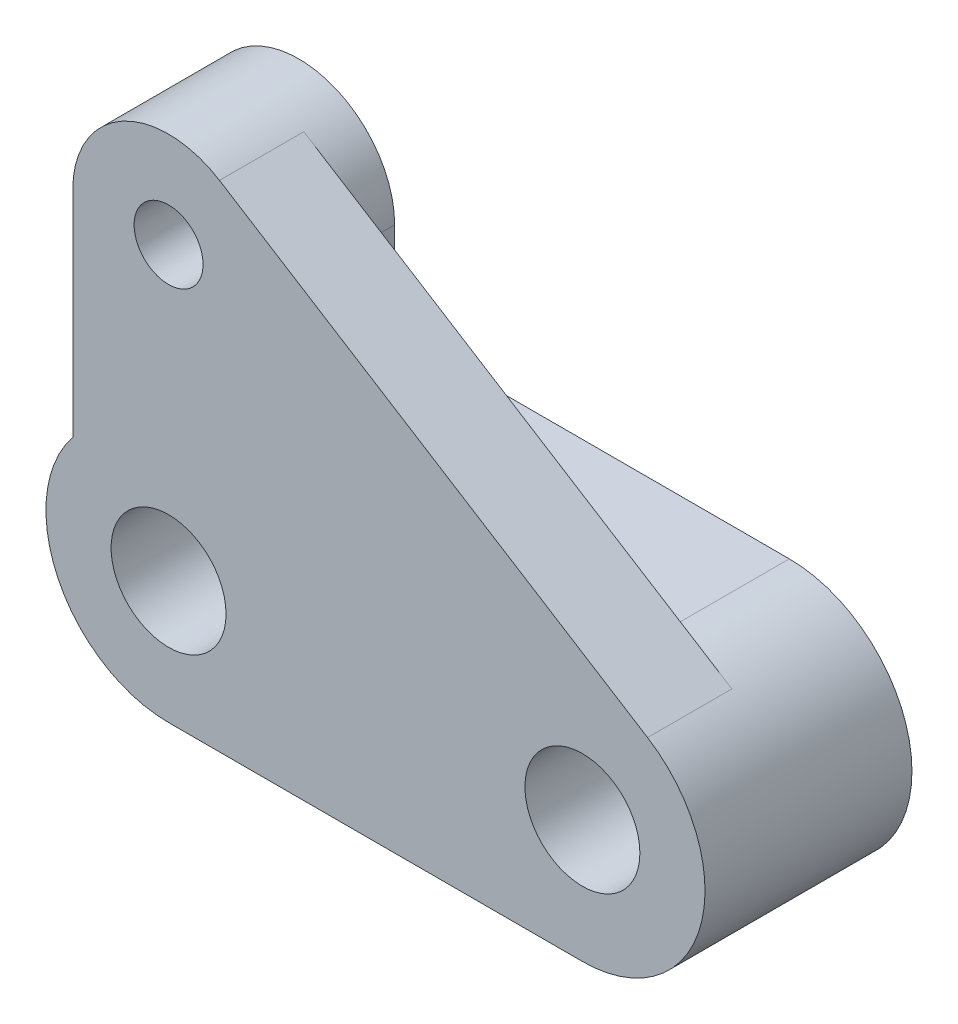
ISO-10303-21;
HEADER;
FILE_DESCRIPTION(('STEP AP214'),'2;1');
FILE_NAME('part.step','',(''),(''),'','','');
FILE_SCHEMA(('AUTOMOTIVE_DESIGN { 1 0 10303 214 1 1 1 1 }'));
ENDSEC;
DATA;
#1=APPLICATION_CONTEXT('core data for automotive mechanical design processes');
#2=APPLICATION_PROTOCOL_DEFINITION('international standard','automotive_design',2000,#1);
#3=PRODUCT_CONTEXT('',#1,'mechanical');
#4=PRODUCT('Part','Part','',(#3));
#5=PRODUCT_RELATED_PRODUCT_CATEGORY('part','',(#4));
#6=PRODUCT_DEFINITION_FORMATION('','',#4);
#7=PRODUCT_DEFINITION_CONTEXT('part definition',#1,'design');
#8=PRODUCT_DEFINITION('design','',#6,#7);
#9=PRODUCT_DEFINITION_SHAPE('','',#8);
#10=(LENGTH_UNIT() NAMED_UNIT(*) SI_UNIT(.MILLI.,.METRE.));
#11=(NAMED_UNIT(*) PLANE_ANGLE_UNIT() SI_UNIT($,.RADIAN.));
#12=(NAMED_UNIT(*) SI_UNIT($,.STERADIAN.) SOLID_ANGLE_UNIT());
#13=UNCERTAINTY_MEASURE_WITH_UNIT(LENGTH_MEASURE(1.E-05),#10,'distance_accuracy_value','');
#14=(GEOMETRIC_REPRESENTATION_CONTEXT(3) GLOBAL_UNCERTAINTY_ASSIGNED_CONTEXT((#13)) GLOBAL_UNIT_ASSIGNED_CONTEXT((#10,
#11,#12)) REPRESENTATION_CONTEXT('',''));
#15=CARTESIAN_POINT('',(0.,0.,0.));
#16=DIRECTION('',(0.,0.,1.));
#17=DIRECTION('',(1.,0.,0.));
#18=AXIS2_PLACEMENT_3D('',#15,#16,#17);
#19=CARTESIAN_POINT('',(-108.,32.,27.));
#20=DIRECTION('',(0.,-1.,0.));
#21=DIRECTION('',(1.,0.,0.));
#22=AXIS2_PLACEMENT_3D('',#19,#20,#21);
#23=PLANE('',#22);
#24=DIRECTION('',(1.,0.,0.));
#25=VECTOR('',#24,1.);
#26=CARTESIAN_POINT('',(0.,32.,5.));
#27=LINE('',#26,#25);
#28=CARTESIAN_POINT('',(-68.,32.,5.));
#29=VERTEX_POINT('',#28);
#30=CARTESIAN_POINT('',(0.,32.,5.));
#31=VERTEX_POINT('',#30);
#32=EDGE_CURVE('E136',#29,#31,#27,.T.);
#33=ORIENTED_EDGE('',*,*,#32,.T.);
#34=DIRECTION('',(0.,0.,-1.));
#35=VECTOR('',#34,1.);
#36=CARTESIAN_POINT('',(0.,32.,27.));
#37=LINE('',#36,#35);
#38=CARTESIAN_POINT('',(0.,32.,-27.));
#39=VERTEX_POINT('',#38);
#40=EDGE_CURVE('E149',#31,#39,#37,.T.);
#41=ORIENTED_EDGE('',*,*,#40,.T.);
#42=DIRECTION('',(-1.,0.,0.));
#43=VECTOR('',#42,1.);
#44=CARTESIAN_POINT('',(-108.,32.,-27.));
#45=LINE('',#44,#43);
#46=CARTESIAN_POINT('',(-108.,32.,-27.));
#47=VERTEX_POINT('',#46);
#48=EDGE_CURVE('E241',#39,#47,#45,.T.);
#49=ORIENTED_EDGE('',*,*,#48,.T.);
#50=DIRECTION('',(0.,0.,-1.));
#51=VECTOR('',#50,1.);
#52=CARTESIAN_POINT('',(-108.,32.,27.));
#53=LINE('',#52,#51);
#54=CARTESIAN_POINT('',(-108.,32.,-7.));
#55=VERTEX_POINT('',#54);
#56=EDGE_CURVE('E257',#55,#47,#53,.T.);
#57=ORIENTED_EDGE('',*,*,#56,.F.);
#58=DIRECTION('',(1.,0.,0.));
#59=VECTOR('',#58,1.);
#60=CARTESIAN_POINT('',(-108.,32.,-7.));
#61=LINE('',#60,#59);
#62=CARTESIAN_POINT('',(-68.,32.,-7.));
#63=VERTEX_POINT('',#62);
#64=EDGE_CURVE('E62',#55,#63,#61,.T.);
#65=ORIENTED_EDGE('',*,*,#64,.T.);
#66=DIRECTION('',(0.,0.,1.));
#67=VECTOR('',#66,1.);
#68=CARTESIAN_POINT('',(-68.,32.,27.));
#69=LINE('',#68,#67);
#70=EDGE_CURVE('E262',#63,#29,#69,.T.);
#71=ORIENTED_EDGE('',*,*,#70,.T.);
#72=EDGE_LOOP('',(#33,#41,#49,#57,#65,#71));
#73=FACE_BOUND('',#72,.T.);
#74=ADVANCED_FACE('F39',(#73),#23,.F.);
#75=CARTESIAN_POINT('',(0.,0.,27.));
#76=DIRECTION('',(0.,0.,-1.));
#77=DIRECTION('',(-1.,0.,0.));
#78=AXIS2_PLACEMENT_3D('',#75,#76,#77);
#79=CYLINDRICAL_SURFACE('',#78,32.);
#80=DIRECTION('',(0.,0.,1.));
#81=VECTOR('',#80,1.);
#82=CARTESIAN_POINT('',(17.0027440323474,27.1091625722831,5.));
#83=LINE('',#82,#81);
#84=CARTESIAN_POINT('',(17.0027440323474,27.1091625722831,5.));
#85=VERTEX_POINT('',#84);
#86=CARTESIAN_POINT('',(17.0027440323474,27.1091625722831,27.));
#87=VERTEX_POINT('',#86);
#88=EDGE_CURVE('E123',#85,#87,#83,.T.);
#89=ORIENTED_EDGE('',*,*,#88,.T.);
#90=CARTESIAN_POINT('',(0.,0.,27.));
#91=DIRECTION('',(0.,0.,1.));
#92=DIRECTION('',(1.,0.,0.));
#93=AXIS2_PLACEMENT_3D('',#90,#91,#92);
#94=CIRCLE('',#93,32.);
#95=CARTESIAN_POINT('',(0.,-32.,27.));
#96=VERTEX_POINT('',#95);
#97=EDGE_CURVE('E228',#96,#87,#94,.T.);
#98=ORIENTED_EDGE('',*,*,#97,.F.);
#99=DIRECTION('',(0.,0.,-1.));
#100=VECTOR('',#99,1.);
#101=CARTESIAN_POINT('',(0.,-32.,27.));
#102=LINE('',#101,#100);
#103=CARTESIAN_POINT('',(0.,-32.,-27.));
#104=VERTEX_POINT('',#103);
#105=EDGE_CURVE('E238',#96,#104,#102,.T.);
#106=ORIENTED_EDGE('',*,*,#105,.T.);
#107=CARTESIAN_POINT('',(0.,0.,-27.));
#108=DIRECTION('',(0.,0.,1.));
#109=DIRECTION('',(1.,0.,0.));
#110=AXIS2_PLACEMENT_3D('',#107,#108,#109);
#111=CIRCLE('',#110,32.);
#112=EDGE_CURVE('E224',#104,#39,#111,.T.);
#113=ORIENTED_EDGE('',*,*,#112,.T.);
#114=ORIENTED_EDGE('',*,*,#40,.F.);
#115=CARTESIAN_POINT('',(0.,0.,5.));
#116=DIRECTION('',(0.,0.,-1.));
#117=DIRECTION('',(1.,0.,0.));
#118=AXIS2_PLACEMENT_3D('',#115,#116,#117);
#119=CIRCLE('',#118,32.);
#120=EDGE_CURVE('E140',#31,#85,#119,.T.);
#121=ORIENTED_EDGE('',*,*,#120,.T.);
#122=EDGE_LOOP('',(#89,#98,#106,#113,#114,#121));
#123=FACE_BOUND('',#122,.T.);
#124=ADVANCED_FACE('F147',(#123),#79,.T.);
#125=CARTESIAN_POINT('',(-108.,76.,-7.));
#126=DIRECTION('',(0.,0.,1.));
#127=DIRECTION('',(1.,0.,0.));
#128=AXIS2_PLACEMENT_3D('',#125,#126,#127);
#129=CYLINDRICAL_SURFACE('',#128,25.);
#130=DIRECTION('',(0.,0.,1.));
#131=VECTOR('',#130,1.);
#132=CARTESIAN_POINT('',(-94.7166062247286,97.1790332595962,5.));
#133=LINE('',#132,#131);
#134=CARTESIAN_POINT('',(-94.7166062247286,97.1790332595962,5.));
#135=VERTEX_POINT('',#134);
#136=CARTESIAN_POINT('',(-94.7166062247286,97.1790332595962,27.));
#137=VERTEX_POINT('',#136);
#138=EDGE_CURVE('E135',#135,#137,#133,.T.);
#139=ORIENTED_EDGE('',*,*,#138,.F.);
#140=CARTESIAN_POINT('',(-108.,76.,5.));
#141=DIRECTION('',(0.,0.,-1.));
#142=DIRECTION('',(1.,0.,0.));
#143=AXIS2_PLACEMENT_3D('',#140,#141,#142);
#144=CIRCLE('',#143,25.);
#145=CARTESIAN_POINT('',(-83.,76.,5.));
#146=VERTEX_POINT('',#145);
#147=EDGE_CURVE('E143',#135,#146,#144,.T.);
#148=ORIENTED_EDGE('',*,*,#147,.T.);
#149=DIRECTION('',(0.,0.,1.));
#150=VECTOR('',#149,1.);
#151=CARTESIAN_POINT('',(-83.,76.,-7.));
#152=LINE('',#151,#150);
#153=CARTESIAN_POINT('',(-83.,76.,-7.));
#154=VERTEX_POINT('',#153);
#155=EDGE_CURVE('E207',#154,#146,#152,.T.);
#156=ORIENTED_EDGE('',*,*,#155,.F.);
#157=CARTESIAN_POINT('',(-108.,76.,-7.));
#158=DIRECTION('',(0.,0.,-1.));
#159=DIRECTION('',(-1.,0.,0.));
#160=AXIS2_PLACEMENT_3D('',#157,#158,#159);
#161=CIRCLE('',#160,25.);
#162=CARTESIAN_POINT('',(-133.,76.,-7.));
#163=VERTEX_POINT('',#162);
#164=EDGE_CURVE('E177',#163,#154,#161,.T.);
#165=ORIENTED_EDGE('',*,*,#164,.F.);
#166=DIRECTION('',(0.,0.,1.));
#167=VECTOR('',#166,1.);
#168=CARTESIAN_POINT('',(-133.,76.,-7.));
#169=LINE('',#168,#167);
#170=CARTESIAN_POINT('',(-133.,76.,27.));
#171=VERTEX_POINT('',#170);
#172=EDGE_CURVE('E195',#163,#171,#169,.T.);
#173=ORIENTED_EDGE('',*,*,#172,.T.);
#174=CARTESIAN_POINT('',(-108.,76.,27.));
#175=DIRECTION('',(0.,0.,-1.));
#176=DIRECTION('',(-1.,0.,0.));
#177=AXIS2_PLACEMENT_3D('',#174,#175,#176);
#178=CIRCLE('',#177,25.);
#179=EDGE_CURVE('E173',#171,#137,#178,.T.);
#180=ORIENTED_EDGE('',*,*,#179,.T.);
#181=EDGE_LOOP('',(#139,#148,#156,#165,#173,#180));
#182=FACE_BOUND('',#181,.T.);
#183=ADVANCED_FACE('F272',(#182),#129,.T.);
#184=CARTESIAN_POINT('',(-83.,76.,-7.));
#185=DIRECTION('',(-1.,0.,0.));
#186=DIRECTION('',(0.,0.,1.));
#187=AXIS2_PLACEMENT_3D('',#184,#185,#186);
#188=PLANE('',#187);
#189=DIRECTION('',(0.,-1.,0.));
#190=VECTOR('',#189,1.);
#191=CARTESIAN_POINT('',(-83.,47.,5.));
#192=LINE('',#191,#190);
#193=CARTESIAN_POINT('',(-83.,47.,5.));
#194=VERTEX_POINT('',#193);
#195=EDGE_CURVE('E157',#146,#194,#192,.T.);
#196=ORIENTED_EDGE('',*,*,#195,.T.);
#197=DIRECTION('',(0.,0.,1.));
#198=VECTOR('',#197,1.);
#199=CARTESIAN_POINT('',(-83.,47.,-7.));
#200=LINE('',#199,#198);
#201=CARTESIAN_POINT('',(-83.,47.,-7.));
#202=VERTEX_POINT('',#201);
#203=EDGE_CURVE('E48',#194,#202,#200,.F.);
#204=ORIENTED_EDGE('',*,*,#203,.T.);
#205=DIRECTION('',(0.,-1.,0.));
#206=VECTOR('',#205,1.);
#207=CARTESIAN_POINT('',(-83.,76.,-7.));
#208=LINE('',#207,#206);
#209=EDGE_CURVE('E181',#154,#202,#208,.T.);
#210=ORIENTED_EDGE('',*,*,#209,.F.);
#211=ORIENTED_EDGE('',*,*,#155,.T.);
#212=EDGE_LOOP('',(#196,#204,#210,#211));
#213=FACE_BOUND('',#212,.T.);
#214=ADVANCED_FACE('F268',(#213),#188,.F.);
#215=CARTESIAN_POINT('',(-68.,47.,27.));
#216=DIRECTION('',(0.,0.,-1.));
#217=DIRECTION('',(-1.,0.,0.));
#218=AXIS2_PLACEMENT_3D('',#215,#216,#217);
#219=CYLINDRICAL_SURFACE('',#218,15.);
#220=CARTESIAN_POINT('',(-68.,47.,5.));
#221=DIRECTION('',(0.,0.,1.));
#222=DIRECTION('',(1.,0.,0.));
#223=AXIS2_PLACEMENT_3D('',#220,#221,#222);
#224=CIRCLE('',#223,15.);
#225=EDGE_CURVE('E160',#194,#29,#224,.T.);
#226=ORIENTED_EDGE('',*,*,#225,.T.);
#227=ORIENTED_EDGE('',*,*,#70,.F.);
#228=CARTESIAN_POINT('',(-68.,47.,-7.));
#229=DIRECTION('',(0.,0.,-1.));
#230=DIRECTION('',(-1.,0.,0.));
#231=AXIS2_PLACEMENT_3D('',#228,#229,#230);
#232=CIRCLE('',#231,15.);
#233=EDGE_CURVE('E11',#202,#63,#232,.F.);
#234=ORIENTED_EDGE('',*,*,#233,.F.);
#235=ORIENTED_EDGE('',*,*,#203,.F.);
#236=EDGE_LOOP('',(#226,#227,#234,#235));
#237=FACE_BOUND('',#236,.T.);
#238=ADVANCED_FACE('F41',(#237),#219,.F.);
#239=CARTESIAN_POINT('',(0.,0.,27.));
#240=DIRECTION('',(0.,0.,1.));
#241=DIRECTION('',(1.,0.,0.));
#242=AXIS2_PLACEMENT_3D('',#239,#240,#241);
#243=PLANE('',#242);
#244=ORIENTED_EDGE('',*,*,#97,.T.);
#245=DIRECTION('',(-0.847161330383847,0.531335751010855,0.));
#246=VECTOR('',#245,1.);
#247=CARTESIAN_POINT('',(-94.7166062247286,97.1790332595962,27.));
#248=LINE('',#247,#246);
#249=EDGE_CURVE('E129',#87,#137,#248,.T.);
#250=ORIENTED_EDGE('',*,*,#249,.T.);
#251=ORIENTED_EDGE('',*,*,#179,.F.);
#252=DIRECTION('',(0.,-1.,0.));
#253=VECTOR('',#252,1.);
#254=CARTESIAN_POINT('',(-133.,76.,27.));
#255=LINE('',#254,#253);
#256=CARTESIAN_POINT('',(-133.,19.9749843554382,27.));
#257=VERTEX_POINT('',#256);
#258=EDGE_CURVE('E182',#171,#257,#255,.T.);
#259=ORIENTED_EDGE('',*,*,#258,.T.);
#260=CARTESIAN_POINT('',(-108.,0.,27.));
#261=DIRECTION('',(0.,0.,1.));
#262=DIRECTION('',(1.,0.,0.));
#263=AXIS2_PLACEMENT_3D('',#260,#261,#262);
#264=CIRCLE('',#263,32.);
#265=CARTESIAN_POINT('',(-108.,-32.,27.));
#266=VERTEX_POINT('',#265);
#267=EDGE_CURVE('E231',#257,#266,#264,.T.);
#268=ORIENTED_EDGE('',*,*,#267,.T.);
#269=DIRECTION('',(1.,0.,0.));
#270=VECTOR('',#269,1.);
#271=CARTESIAN_POINT('',(0.,-32.,27.));
#272=LINE('',#271,#270);
#273=EDGE_CURVE('E235',#266,#96,#272,.T.);
#274=ORIENTED_EDGE('',*,*,#273,.T.);
#275=EDGE_LOOP('',(#244,#250,#251,#259,#268,#274));
#276=FACE_BOUND('',#275,.T.);
#277=CARTESIAN_POINT('',(-108.,76.,27.));
#278=DIRECTION('',(0.,0.,-1.));
#279=DIRECTION('',(-1.,0.,0.));
#280=AXIS2_PLACEMENT_3D('',#277,#278,#279);
#281=CIRCLE('',#280,9.00000000000001);
#282=CARTESIAN_POINT('',(-117.,76.,27.));
#283=VERTEX_POINT('',#282);
#284=EDGE_CURVE('E167',#283,#283,#281,.T.);
#285=ORIENTED_EDGE('',*,*,#284,.T.);
#286=EDGE_LOOP('',(#285));
#287=FACE_BOUND('',#286,.T.);
#288=CARTESIAN_POINT('',(0.,0.,27.));
#289=DIRECTION('',(0.,0.,1.));
#290=DIRECTION('',(1.,0.,0.));
#291=AXIS2_PLACEMENT_3D('',#288,#289,#290);
#292=CIRCLE('',#291,15.);
#293=CARTESIAN_POINT('',(15.,0.,27.));
#294=VERTEX_POINT('',#293);
#295=EDGE_CURVE('E220',#294,#294,#292,.T.);
#296=ORIENTED_EDGE('',*,*,#295,.F.);
#297=EDGE_LOOP('',(#296));
#298=FACE_BOUND('',#297,.T.);
#299=CARTESIAN_POINT('',(-108.,0.,27.));
#300=DIRECTION('',(0.,0.,1.));
#301=DIRECTION('',(1.,0.,0.));
#302=AXIS2_PLACEMENT_3D('',#299,#300,#301);
#303=CIRCLE('',#302,15.);
#304=CARTESIAN_POINT('',(-93.,0.,27.));
#305=VERTEX_POINT('',#304);
#306=EDGE_CURVE('E212',#305,#305,#303,.T.);
#307=ORIENTED_EDGE('',*,*,#306,.F.);
#308=EDGE_LOOP('',(#307));
#309=FACE_BOUND('',#308,.T.);
#310=ADVANCED_FACE('F276',(#276,#287,#298,#309),#243,.T.);
#311=CARTESIAN_POINT('',(0.,0.,-27.));
#312=DIRECTION('',(0.,0.,1.));
#313=DIRECTION('',(1.,0.,0.));
#314=AXIS2_PLACEMENT_3D('',#311,#312,#313);
#315=PLANE('',#314);
#316=ORIENTED_EDGE('',*,*,#112,.F.);
#317=DIRECTION('',(1.,0.,0.));
#318=VECTOR('',#317,1.);
#319=CARTESIAN_POINT('',(0.,-32.,-27.));
#320=LINE('',#319,#318);
#321=CARTESIAN_POINT('',(-108.,-32.,-27.));
#322=VERTEX_POINT('',#321);
#323=EDGE_CURVE('E232',#322,#104,#320,.T.);
#324=ORIENTED_EDGE('',*,*,#323,.F.);
#325=CARTESIAN_POINT('',(-108.,0.,-27.));
#326=DIRECTION('',(0.,0.,1.));
#327=DIRECTION('',(1.,0.,0.));
#328=AXIS2_PLACEMENT_3D('',#325,#326,#327);
#329=CIRCLE('',#328,32.);
#330=EDGE_CURVE('E245',#47,#322,#329,.T.);
#331=ORIENTED_EDGE('',*,*,#330,.F.);
#332=ORIENTED_EDGE('',*,*,#48,.F.);
#333=EDGE_LOOP('',(#316,#324,#331,#332));
#334=FACE_BOUND('',#333,.T.);
#335=CARTESIAN_POINT('',(0.,0.,-27.));
#336=DIRECTION('',(0.,0.,1.));
#337=DIRECTION('',(1.,0.,0.));
#338=AXIS2_PLACEMENT_3D('',#335,#336,#337);
#339=CIRCLE('',#338,15.);
#340=CARTESIAN_POINT('',(15.,0.,-27.));
#341=VERTEX_POINT('',#340);
#342=EDGE_CURVE('E216',#341,#341,#339,.T.);
#343=ORIENTED_EDGE('',*,*,#342,.T.);
#344=EDGE_LOOP('',(#343));
#345=FACE_BOUND('',#344,.T.);
#346=CARTESIAN_POINT('',(-108.,0.,-27.));
#347=DIRECTION('',(0.,0.,1.));
#348=DIRECTION('',(1.,0.,0.));
#349=AXIS2_PLACEMENT_3D('',#346,#347,#348);
#350=CIRCLE('',#349,15.);
#351=CARTESIAN_POINT('',(-93.,0.,-27.));
#352=VERTEX_POINT('',#351);
#353=EDGE_CURVE('E211',#352,#352,#350,.T.);
#354=ORIENTED_EDGE('',*,*,#353,.T.);
#355=EDGE_LOOP('',(#354));
#356=FACE_BOUND('',#355,.T.);
#357=ADVANCED_FACE('F286',(#334,#345,#356),#315,.F.);
#358=CARTESIAN_POINT('',(-108.,0.,27.));
#359=DIRECTION('',(0.,0.,-1.));
#360=DIRECTION('',(-1.,0.,0.));
#361=AXIS2_PLACEMENT_3D('',#358,#359,#360);
#362=CYLINDRICAL_SURFACE('',#361,32.);
#363=ORIENTED_EDGE('',*,*,#267,.F.);
#364=DIRECTION('',(0.,0.,1.));
#365=VECTOR('',#364,1.);
#366=CARTESIAN_POINT('',(-133.,19.9749843554382,-7.));
#367=LINE('',#366,#365);
#368=CARTESIAN_POINT('',(-133.,19.9749843554382,-7.));
#369=VERTEX_POINT('',#368);
#370=EDGE_CURVE('E203',#369,#257,#367,.T.);
#371=ORIENTED_EDGE('',*,*,#370,.F.);
#372=CARTESIAN_POINT('',(-108.,0.,-7.));
#373=DIRECTION('',(0.,0.,-1.));
#374=DIRECTION('',(-1.,0.,0.));
#375=AXIS2_PLACEMENT_3D('',#372,#373,#374);
#376=CIRCLE('',#375,32.);
#377=EDGE_CURVE('E187',#369,#55,#376,.T.);
#378=ORIENTED_EDGE('',*,*,#377,.T.);
#379=ORIENTED_EDGE('',*,*,#56,.T.);
#380=ORIENTED_EDGE('',*,*,#330,.T.);
#381=DIRECTION('',(0.,0.,-1.));
#382=VECTOR('',#381,1.);
#383=CARTESIAN_POINT('',(-108.,-32.,27.));
#384=LINE('',#383,#382);
#385=EDGE_CURVE('E253',#266,#322,#384,.T.);
#386=ORIENTED_EDGE('',*,*,#385,.F.);
#387=EDGE_LOOP('',(#363,#371,#378,#379,#380,#386));
#388=FACE_BOUND('',#387,.T.);
#389=ADVANCED_FACE('F291',(#388),#362,.T.);
#390=CARTESIAN_POINT('',(0.,-32.,27.));
#391=DIRECTION('',(0.,1.,0.));
#392=DIRECTION('',(-1.,0.,0.));
#393=AXIS2_PLACEMENT_3D('',#390,#391,#392);
#394=PLANE('',#393);
#395=ORIENTED_EDGE('',*,*,#323,.T.);
#396=ORIENTED_EDGE('',*,*,#105,.F.);
#397=ORIENTED_EDGE('',*,*,#273,.F.);
#398=ORIENTED_EDGE('',*,*,#385,.T.);
#399=EDGE_LOOP('',(#395,#396,#397,#398));
#400=FACE_BOUND('',#399,.T.);
#401=ADVANCED_FACE('F298',(#400),#394,.F.);
#402=CARTESIAN_POINT('',(0.,0.,27.));
#403=DIRECTION('',(0.,0.,-1.));
#404=DIRECTION('',(-1.,0.,0.));
#405=AXIS2_PLACEMENT_3D('',#402,#403,#404);
#406=CYLINDRICAL_SURFACE('',#405,15.);
#407=ORIENTED_EDGE('',*,*,#295,.T.);
#408=EDGE_LOOP('',(#407));
#409=FACE_BOUND('',#408,.T.);
#410=ORIENTED_EDGE('',*,*,#342,.F.);
#411=EDGE_LOOP('',(#410));
#412=FACE_BOUND('',#411,.T.);
#413=ADVANCED_FACE('F300',(#409,#412),#406,.F.);
#414=CARTESIAN_POINT('',(-108.,0.,27.));
#415=DIRECTION('',(0.,0.,-1.));
#416=DIRECTION('',(-1.,0.,0.));
#417=AXIS2_PLACEMENT_3D('',#414,#415,#416);
#418=CYLINDRICAL_SURFACE('',#417,15.);
#419=ORIENTED_EDGE('',*,*,#306,.T.);
#420=EDGE_LOOP('',(#419));
#421=FACE_BOUND('',#420,.T.);
#422=ORIENTED_EDGE('',*,*,#353,.F.);
#423=EDGE_LOOP('',(#422));
#424=FACE_BOUND('',#423,.T.);
#425=ADVANCED_FACE('F306',(#421,#424),#418,.F.);
#426=CARTESIAN_POINT('',(-133.,76.,-7.));
#427=DIRECTION('',(-1.,0.,0.));
#428=DIRECTION('',(0.,0.,1.));
#429=AXIS2_PLACEMENT_3D('',#426,#427,#428);
#430=PLANE('',#429);
#431=ORIENTED_EDGE('',*,*,#258,.F.);
#432=ORIENTED_EDGE('',*,*,#172,.F.);
#433=DIRECTION('',(0.,-1.,0.));
#434=VECTOR('',#433,1.);
#435=CARTESIAN_POINT('',(-133.,76.,-7.));
#436=LINE('',#435,#434);
#437=EDGE_CURVE('E191',#163,#369,#436,.T.);
#438=ORIENTED_EDGE('',*,*,#437,.T.);
#439=ORIENTED_EDGE('',*,*,#370,.T.);
#440=EDGE_LOOP('',(#431,#432,#438,#439));
#441=FACE_BOUND('',#440,.T.);
#442=ADVANCED_FACE('F297',(#441),#430,.T.);
#443=CARTESIAN_POINT('',(-108.,76.,-7.));
#444=DIRECTION('',(0.,0.,-1.));
#445=DIRECTION('',(-1.,0.,0.));
#446=AXIS2_PLACEMENT_3D('',#443,#444,#445);
#447=PLANE('',#446);
#448=CARTESIAN_POINT('',(-108.,76.,-7.));
#449=DIRECTION('',(0.,0.,-1.));
#450=DIRECTION('',(-1.,0.,0.));
#451=AXIS2_PLACEMENT_3D('',#448,#449,#450);
#452=CIRCLE('',#451,9.00000000000001);
#453=CARTESIAN_POINT('',(-117.,76.,-7.));
#454=VERTEX_POINT('',#453);
#455=EDGE_CURVE('E169',#454,#454,#452,.T.);
#456=ORIENTED_EDGE('',*,*,#455,.F.);
#457=EDGE_LOOP('',(#456));
#458=FACE_BOUND('',#457,.T.);
#459=ORIENTED_EDGE('',*,*,#164,.T.);
#460=ORIENTED_EDGE('',*,*,#209,.T.);
#461=ORIENTED_EDGE('',*,*,#233,.T.);
#462=ORIENTED_EDGE('',*,*,#64,.F.);
#463=ORIENTED_EDGE('',*,*,#377,.F.);
#464=ORIENTED_EDGE('',*,*,#437,.F.);
#465=EDGE_LOOP('',(#459,#460,#461,#462,#463,#464));
#466=FACE_BOUND('',#465,.T.);
#467=ADVANCED_FACE('F295',(#458,#466),#447,.T.);
#468=CARTESIAN_POINT('',(-108.,76.,-7.));
#469=DIRECTION('',(0.,0.,1.));
#470=DIRECTION('',(1.,0.,0.));
#471=AXIS2_PLACEMENT_3D('',#468,#469,#470);
#472=CYLINDRICAL_SURFACE('',#471,9.00000000000001);
#473=ORIENTED_EDGE('',*,*,#455,.T.);
#474=EDGE_LOOP('',(#473));
#475=FACE_BOUND('',#474,.T.);
#476=ORIENTED_EDGE('',*,*,#284,.F.);
#477=EDGE_LOOP('',(#476));
#478=FACE_BOUND('',#477,.T.);
#479=ADVANCED_FACE('F360',(#475,#478),#472,.F.);
#480=CARTESIAN_POINT('',(-94.7166062247286,97.1790332595962,5.));
#481=DIRECTION('',(0.531335751010855,0.847161330383847,0.));
#482=DIRECTION('',(-0.847161330383847,0.531335751010855,0.));
#483=AXIS2_PLACEMENT_3D('',#480,#481,#482);
#484=PLANE('',#483);
#485=ORIENTED_EDGE('',*,*,#249,.F.);
#486=ORIENTED_EDGE('',*,*,#88,.F.);
#487=DIRECTION('',(-0.847161330383847,0.531335751010855,0.));
#488=VECTOR('',#487,1.);
#489=CARTESIAN_POINT('',(-94.7166062247286,97.1790332595962,5.));
#490=LINE('',#489,#488);
#491=EDGE_CURVE('E126',#85,#135,#490,.T.);
#492=ORIENTED_EDGE('',*,*,#491,.T.);
#493=ORIENTED_EDGE('',*,*,#138,.T.);
#494=EDGE_LOOP('',(#485,#486,#492,#493));
#495=FACE_BOUND('',#494,.T.);
#496=ADVANCED_FACE('F125',(#495),#484,.T.);
#497=CARTESIAN_POINT('',(0.,0.,5.));
#498=DIRECTION('',(0.,0.,1.));
#499=DIRECTION('',(1.,0.,0.));
#500=AXIS2_PLACEMENT_3D('',#497,#498,#499);
#501=PLANE('',#500);
#502=ORIENTED_EDGE('',*,*,#120,.F.);
#503=ORIENTED_EDGE('',*,*,#32,.F.);
#504=ORIENTED_EDGE('',*,*,#225,.F.);
#505=ORIENTED_EDGE('',*,*,#195,.F.);
#506=ORIENTED_EDGE('',*,*,#147,.F.);
#507=ORIENTED_EDGE('',*,*,#491,.F.);
#508=EDGE_LOOP('',(#502,#503,#504,#505,#506,#507));
#509=FACE_BOUND('',#508,.T.);
#510=ADVANCED_FACE('F139',(#509),#501,.F.);
#511=CLOSED_SHELL('',(#74,#124,#183,#214,#238,#310,#357,#389,#401,#413,#425,#442,#467,#479,#496,#510));
#512=MANIFOLD_SOLID_BREP('B2',#511);
#513=ADVANCED_BREP_SHAPE_REPRESENTATION('',(#18,#512),#14);
#514=SHAPE_DEFINITION_REPRESENTATION(#9,#513);
ENDSEC;
END-ISO-10303-21;
